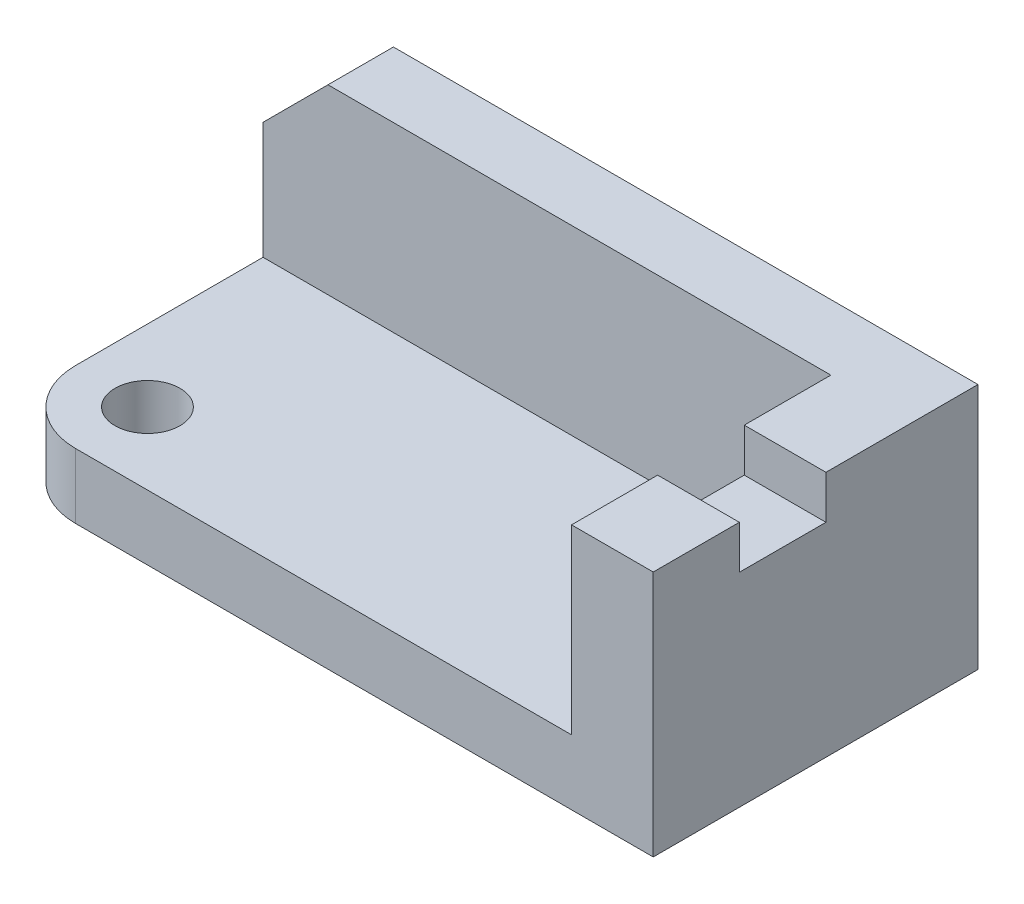
ISO-10303-21;
HEADER;
FILE_DESCRIPTION(('STEP AP214'),'2;1');
FILE_NAME('part.step','',(''),(''),'','','');
FILE_SCHEMA(('AUTOMOTIVE_DESIGN { 1 0 10303 214 1 1 1 1 }'));
ENDSEC;
DATA;
#1=APPLICATION_CONTEXT('core data for automotive mechanical design processes');
#2=APPLICATION_PROTOCOL_DEFINITION('international standard','automotive_design',2000,#1);
#3=PRODUCT_CONTEXT('',#1,'mechanical');
#4=PRODUCT('Part','Part','',(#3));
#5=PRODUCT_RELATED_PRODUCT_CATEGORY('part','',(#4));
#6=PRODUCT_DEFINITION_FORMATION('','',#4);
#7=PRODUCT_DEFINITION_CONTEXT('part definition',#1,'design');
#8=PRODUCT_DEFINITION('design','',#6,#7);
#9=PRODUCT_DEFINITION_SHAPE('','',#8);
#10=(LENGTH_UNIT() NAMED_UNIT(*) SI_UNIT(.MILLI.,.METRE.));
#11=(NAMED_UNIT(*) PLANE_ANGLE_UNIT() SI_UNIT($,.RADIAN.));
#12=(NAMED_UNIT(*) SI_UNIT($,.STERADIAN.) SOLID_ANGLE_UNIT());
#13=UNCERTAINTY_MEASURE_WITH_UNIT(LENGTH_MEASURE(1.E-05),#10,'distance_accuracy_value','');
#14=(GEOMETRIC_REPRESENTATION_CONTEXT(3) GLOBAL_UNCERTAINTY_ASSIGNED_CONTEXT((#13)) GLOBAL_UNIT_ASSIGNED_CONTEXT((#10,
#11,#12)) REPRESENTATION_CONTEXT('',''));
#15=CARTESIAN_POINT('',(0.,0.,0.));
#16=DIRECTION('',(0.,0.,1.));
#17=DIRECTION('',(1.,0.,0.));
#18=AXIS2_PLACEMENT_3D('',#15,#16,#17);
#19=CARTESIAN_POINT('',(0.,57.,0.));
#20=DIRECTION('',(0.,1.,0.));
#21=DIRECTION('',(0.,0.,1.));
#22=AXIS2_PLACEMENT_3D('',#19,#20,#21);
#23=PLANE('',#22);
#24=DIRECTION('',(-1.,0.,0.));
#25=VECTOR('',#24,1.);
#26=CARTESIAN_POINT('',(-18.8647914661121,57.,35.1133332353525));
#27=LINE('',#26,#25);
#28=CARTESIAN_POINT('',(0.,57.,35.1133332353525));
#29=VERTEX_POINT('',#28);
#30=CARTESIAN_POINT('',(-18.8647914661121,57.,35.1133332353525));
#31=VERTEX_POINT('',#30);
#32=EDGE_CURVE('E146',#29,#31,#27,.T.);
#33=ORIENTED_EDGE('',*,*,#32,.F.);
#34=DIRECTION('',(0.,0.,-1.));
#35=VECTOR('',#34,1.);
#36=CARTESIAN_POINT('',(0.,57.,0.));
#37=LINE('',#36,#35);
#38=CARTESIAN_POINT('',(0.,57.,0.));
#39=VERTEX_POINT('',#38);
#40=EDGE_CURVE('E162',#29,#39,#37,.T.);
#41=ORIENTED_EDGE('',*,*,#40,.T.);
#42=DIRECTION('',(-1.,0.,0.));
#43=VECTOR('',#42,1.);
#44=CARTESIAN_POINT('',(0.,57.,0.));
#45=LINE('',#44,#43);
#46=CARTESIAN_POINT('',(-135.,57.,0.));
#47=VERTEX_POINT('',#46);
#48=EDGE_CURVE('E161',#39,#47,#45,.T.);
#49=ORIENTED_EDGE('',*,*,#48,.T.);
#50=DIRECTION('',(0.,0.,1.));
#51=VECTOR('',#50,1.);
#52=CARTESIAN_POINT('',(-135.,57.,15.1133332353525));
#53=LINE('',#52,#51);
#54=CARTESIAN_POINT('',(-135.,57.,15.1133332353525));
#55=VERTEX_POINT('',#54);
#56=EDGE_CURVE('E226',#47,#55,#53,.T.);
#57=ORIENTED_EDGE('',*,*,#56,.T.);
#58=DIRECTION('',(1.,0.,0.));
#59=VECTOR('',#58,1.);
#60=CARTESIAN_POINT('',(-18.8647914661121,57.,15.1133332353525));
#61=LINE('',#60,#59);
#62=CARTESIAN_POINT('',(-18.8647914661121,57.,15.1133332353525));
#63=VERTEX_POINT('',#62);
#64=EDGE_CURVE('E165',#55,#63,#61,.T.);
#65=ORIENTED_EDGE('',*,*,#64,.T.);
#66=DIRECTION('',(0.,0.,1.));
#67=VECTOR('',#66,1.);
#68=CARTESIAN_POINT('',(-18.8647914661121,57.,15.1133332353525));
#69=LINE('',#68,#67);
#70=EDGE_CURVE('E167',#63,#31,#69,.T.);
#71=ORIENTED_EDGE('',*,*,#70,.T.);
#72=EDGE_LOOP('',(#33,#41,#49,#57,#65,#71));
#73=FACE_BOUND('',#72,.T.);
#74=ADVANCED_FACE('F36',(#73),#23,.T.);
#75=CARTESIAN_POINT('',(-133.396551724138,15.,58.3965517241379));
#76=DIRECTION('',(0.,1.,0.));
#77=DIRECTION('',(0.,0.,1.));
#78=AXIS2_PLACEMENT_3D('',#75,#76,#77);
#79=PLANE('',#78);
#80=DIRECTION('',(0.,0.,1.));
#81=VECTOR('',#80,1.);
#82=CARTESIAN_POINT('',(-18.8647914661121,15.,15.1133332353525));
#83=LINE('',#82,#81);
#84=CARTESIAN_POINT('',(-18.8647914661121,15.,15.1133332353525));
#85=VERTEX_POINT('',#84);
#86=CARTESIAN_POINT('',(-18.8647914661121,15.,75.));
#87=VERTEX_POINT('',#86);
#88=EDGE_CURVE('E177',#85,#87,#83,.T.);
#89=ORIENTED_EDGE('',*,*,#88,.F.);
#90=DIRECTION('',(1.,0.,0.));
#91=VECTOR('',#90,1.);
#92=CARTESIAN_POINT('',(-18.8647914661121,15.,15.1133332353525));
#93=LINE('',#92,#91);
#94=CARTESIAN_POINT('',(-150.,15.,15.1133332353525));
#95=VERTEX_POINT('',#94);
#96=EDGE_CURVE('E174',#95,#85,#93,.T.);
#97=ORIENTED_EDGE('',*,*,#96,.F.);
#98=DIRECTION('',(0.,0.,1.));
#99=VECTOR('',#98,1.);
#100=CARTESIAN_POINT('',(-150.,15.,58.3965517241379));
#101=LINE('',#100,#99);
#102=CARTESIAN_POINT('',(-150.,15.,58.3965517241379));
#103=VERTEX_POINT('',#102);
#104=EDGE_CURVE('E195',#95,#103,#101,.T.);
#105=ORIENTED_EDGE('',*,*,#104,.T.);
#106=CARTESIAN_POINT('',(-133.396551724138,15.,58.3965517241379));
#107=DIRECTION('',(0.,1.,0.));
#108=DIRECTION('',(0.,0.,1.));
#109=AXIS2_PLACEMENT_3D('',#106,#107,#108);
#110=CIRCLE('',#109,16.6034482758621);
#111=CARTESIAN_POINT('',(-133.396551724138,15.,75.));
#112=VERTEX_POINT('',#111);
#113=EDGE_CURVE('E197',#103,#112,#110,.T.);
#114=ORIENTED_EDGE('',*,*,#113,.T.);
#115=DIRECTION('',(1.,0.,0.));
#116=VECTOR('',#115,1.);
#117=CARTESIAN_POINT('',(-133.396551724138,15.,75.));
#118=LINE('',#117,#116);
#119=EDGE_CURVE('E200',#112,#87,#118,.T.);
#120=ORIENTED_EDGE('',*,*,#119,.T.);
#121=EDGE_LOOP('',(#89,#97,#105,#114,#120));
#122=FACE_BOUND('',#121,.T.);
#123=CARTESIAN_POINT('',(-133.396551724138,15.,58.3965517241379));
#124=DIRECTION('',(0.,1.,0.));
#125=DIRECTION('',(0.,0.,1.));
#126=AXIS2_PLACEMENT_3D('',#123,#124,#125);
#127=CIRCLE('',#126,7.50000000000001);
#128=CARTESIAN_POINT('',(-133.396551724138,15.,65.8965517241379));
#129=VERTEX_POINT('',#128);
#130=EDGE_CURVE('E189',#129,#129,#127,.T.);
#131=ORIENTED_EDGE('',*,*,#130,.F.);
#132=EDGE_LOOP('',(#131));
#133=FACE_BOUND('',#132,.T.);
#134=ADVANCED_FACE('F264',(#122,#133),#79,.T.);
#135=CARTESIAN_POINT('',(-133.396551724138,0.,58.3965517241379));
#136=DIRECTION('',(0.,1.,0.));
#137=DIRECTION('',(0.,0.,1.));
#138=AXIS2_PLACEMENT_3D('',#135,#136,#137);
#139=PLANE('',#138);
#140=DIRECTION('',(0.,0.,-1.));
#141=VECTOR('',#140,1.);
#142=CARTESIAN_POINT('',(0.,0.,75.));
#143=LINE('',#142,#141);
#144=CARTESIAN_POINT('',(0.,0.,75.));
#145=VERTEX_POINT('',#144);
#146=CARTESIAN_POINT('',(0.,0.,0.));
#147=VERTEX_POINT('',#146);
#148=EDGE_CURVE('E192',#145,#147,#143,.T.);
#149=ORIENTED_EDGE('',*,*,#148,.F.);
#150=DIRECTION('',(1.,0.,0.));
#151=VECTOR('',#150,1.);
#152=CARTESIAN_POINT('',(-133.396551724138,0.,75.));
#153=LINE('',#152,#151);
#154=CARTESIAN_POINT('',(-133.396551724138,0.,75.));
#155=VERTEX_POINT('',#154);
#156=EDGE_CURVE('E198',#155,#145,#153,.T.);
#157=ORIENTED_EDGE('',*,*,#156,.F.);
#158=CARTESIAN_POINT('',(-133.396551724138,0.,58.3965517241379));
#159=DIRECTION('',(0.,1.,0.));
#160=DIRECTION('',(0.,0.,1.));
#161=AXIS2_PLACEMENT_3D('',#158,#159,#160);
#162=CIRCLE('',#161,16.6034482758621);
#163=CARTESIAN_POINT('',(-150.,0.,58.3965517241379));
#164=VERTEX_POINT('',#163);
#165=EDGE_CURVE('E210',#164,#155,#162,.T.);
#166=ORIENTED_EDGE('',*,*,#165,.F.);
#167=DIRECTION('',(0.,0.,1.));
#168=VECTOR('',#167,1.);
#169=CARTESIAN_POINT('',(-150.,0.,58.3965517241379));
#170=LINE('',#169,#168);
#171=CARTESIAN_POINT('',(-150.,0.,0.));
#172=VERTEX_POINT('',#171);
#173=EDGE_CURVE('E208',#172,#164,#170,.T.);
#174=ORIENTED_EDGE('',*,*,#173,.F.);
#175=DIRECTION('',(-1.,0.,0.));
#176=VECTOR('',#175,1.);
#177=CARTESIAN_POINT('',(-150.,0.,0.));
#178=LINE('',#177,#176);
#179=EDGE_CURVE('E205',#147,#172,#178,.T.);
#180=ORIENTED_EDGE('',*,*,#179,.F.);
#181=EDGE_LOOP('',(#149,#157,#166,#174,#180));
#182=FACE_BOUND('',#181,.T.);
#183=CARTESIAN_POINT('',(-133.396551724138,0.,58.3965517241379));
#184=DIRECTION('',(0.,1.,0.));
#185=DIRECTION('',(0.,0.,1.));
#186=AXIS2_PLACEMENT_3D('',#183,#184,#185);
#187=CIRCLE('',#186,7.50000000000001);
#188=CARTESIAN_POINT('',(-133.396551724138,0.,65.8965517241379));
#189=VERTEX_POINT('',#188);
#190=EDGE_CURVE('E188',#189,#189,#187,.T.);
#191=ORIENTED_EDGE('',*,*,#190,.T.);
#192=EDGE_LOOP('',(#191));
#193=FACE_BOUND('',#192,.T.);
#194=ADVANCED_FACE('F255',(#182,#193),#139,.F.);
#195=CARTESIAN_POINT('',(0.,15.,75.));
#196=DIRECTION('',(-1.,0.,0.));
#197=DIRECTION('',(0.,0.,1.));
#198=AXIS2_PLACEMENT_3D('',#195,#196,#197);
#199=PLANE('',#198);
#200=ORIENTED_EDGE('',*,*,#40,.F.);
#201=DIRECTION('',(0.,1.,0.));
#202=VECTOR('',#201,1.);
#203=CARTESIAN_POINT('',(0.,47.,35.1133332353525));
#204=LINE('',#203,#202);
#205=CARTESIAN_POINT('',(0.,47.,35.1133332353525));
#206=VERTEX_POINT('',#205);
#207=EDGE_CURVE('E153',#206,#29,#204,.T.);
#208=ORIENTED_EDGE('',*,*,#207,.F.);
#209=DIRECTION('',(0.,0.,-1.));
#210=VECTOR('',#209,1.);
#211=CARTESIAN_POINT('',(0.,47.,35.1133332353525));
#212=LINE('',#211,#210);
#213=CARTESIAN_POINT('',(0.,47.,55.1133332353525));
#214=VERTEX_POINT('',#213);
#215=EDGE_CURVE('E136',#214,#206,#212,.T.);
#216=ORIENTED_EDGE('',*,*,#215,.F.);
#217=DIRECTION('',(0.,1.,0.));
#218=VECTOR('',#217,1.);
#219=CARTESIAN_POINT('',(0.,47.,55.1133332353525));
#220=LINE('',#219,#218);
#221=CARTESIAN_POINT('',(0.,57.,55.1133332353525));
#222=VERTEX_POINT('',#221);
#223=EDGE_CURVE('E133',#214,#222,#220,.T.);
#224=ORIENTED_EDGE('',*,*,#223,.T.);
#225=CARTESIAN_POINT('',(0.,57.,75.));
#226=VERTEX_POINT('',#225);
#227=EDGE_CURVE('E158',#226,#222,#37,.T.);
#228=ORIENTED_EDGE('',*,*,#227,.F.);
#229=DIRECTION('',(0.,-1.,0.));
#230=VECTOR('',#229,1.);
#231=CARTESIAN_POINT('',(0.,15.,75.));
#232=LINE('',#231,#230);
#233=EDGE_CURVE('E202',#226,#145,#232,.T.);
#234=ORIENTED_EDGE('',*,*,#233,.T.);
#235=ORIENTED_EDGE('',*,*,#148,.T.);
#236=DIRECTION('',(0.,-1.,0.));
#237=VECTOR('',#236,1.);
#238=CARTESIAN_POINT('',(0.,15.,0.));
#239=LINE('',#238,#237);
#240=EDGE_CURVE('E223',#39,#147,#239,.T.);
#241=ORIENTED_EDGE('',*,*,#240,.F.);
#242=EDGE_LOOP('',(#200,#208,#216,#224,#228,#234,#235,#241));
#243=FACE_BOUND('',#242,.T.);
#244=ADVANCED_FACE('F250',(#243),#199,.F.);
#245=CARTESIAN_POINT('',(-150.,15.,0.));
#246=DIRECTION('',(0.,0.,1.));
#247=DIRECTION('',(1.,0.,0.));
#248=AXIS2_PLACEMENT_3D('',#245,#246,#247);
#249=PLANE('',#248);
#250=DIRECTION('',(0.,-1.,0.));
#251=VECTOR('',#250,1.);
#252=CARTESIAN_POINT('',(-150.,15.,0.));
#253=LINE('',#252,#251);
#254=CARTESIAN_POINT('',(-150.,42.,0.));
#255=VERTEX_POINT('',#254);
#256=EDGE_CURVE('E221',#255,#172,#253,.T.);
#257=ORIENTED_EDGE('',*,*,#256,.F.);
#258=DIRECTION('',(0.707106781186546,0.707106781186549,0.));
#259=VECTOR('',#258,1.);
#260=CARTESIAN_POINT('',(-135.,57.,0.));
#261=LINE('',#260,#259);
#262=EDGE_CURVE('E11',#255,#47,#261,.T.);
#263=ORIENTED_EDGE('',*,*,#262,.T.);
#264=ORIENTED_EDGE('',*,*,#48,.F.);
#265=ORIENTED_EDGE('',*,*,#240,.T.);
#266=ORIENTED_EDGE('',*,*,#179,.T.);
#267=EDGE_LOOP('',(#257,#263,#264,#265,#266));
#268=FACE_BOUND('',#267,.T.);
#269=ADVANCED_FACE('F243',(#268),#249,.F.);
#270=CARTESIAN_POINT('',(-150.,15.,58.3965517241379));
#271=DIRECTION('',(1.,0.,0.));
#272=DIRECTION('',(0.,0.,-1.));
#273=AXIS2_PLACEMENT_3D('',#270,#271,#272);
#274=PLANE('',#273);
#275=DIRECTION('',(0.,-1.,0.));
#276=VECTOR('',#275,1.);
#277=CARTESIAN_POINT('',(-150.,57.,15.1133332353525));
#278=LINE('',#277,#276);
#279=CARTESIAN_POINT('',(-150.,42.,15.1133332353525));
#280=VERTEX_POINT('',#279);
#281=EDGE_CURVE('E186',#280,#95,#278,.T.);
#282=ORIENTED_EDGE('',*,*,#281,.F.);
#283=DIRECTION('',(0.,0.,-1.));
#284=VECTOR('',#283,1.);
#285=CARTESIAN_POINT('',(-150.,42.,0.));
#286=LINE('',#285,#284);
#287=EDGE_CURVE('E45',#280,#255,#286,.T.);
#288=ORIENTED_EDGE('',*,*,#287,.T.);
#289=ORIENTED_EDGE('',*,*,#256,.T.);
#290=ORIENTED_EDGE('',*,*,#173,.T.);
#291=DIRECTION('',(0.,-1.,0.));
#292=VECTOR('',#291,1.);
#293=CARTESIAN_POINT('',(-150.,15.,58.3965517241379));
#294=LINE('',#293,#292);
#295=EDGE_CURVE('E218',#103,#164,#294,.T.);
#296=ORIENTED_EDGE('',*,*,#295,.F.);
#297=ORIENTED_EDGE('',*,*,#104,.F.);
#298=EDGE_LOOP('',(#282,#288,#289,#290,#296,#297));
#299=FACE_BOUND('',#298,.T.);
#300=ADVANCED_FACE('F238',(#299),#274,.F.);
#301=CARTESIAN_POINT('',(-133.396551724138,15.,58.3965517241379));
#302=DIRECTION('',(0.,-1.,0.));
#303=DIRECTION('',(0.,0.,-1.));
#304=AXIS2_PLACEMENT_3D('',#301,#302,#303);
#305=CYLINDRICAL_SURFACE('',#304,16.6034482758621);
#306=ORIENTED_EDGE('',*,*,#165,.T.);
#307=DIRECTION('',(0.,-1.,0.));
#308=VECTOR('',#307,1.);
#309=CARTESIAN_POINT('',(-133.396551724138,15.,75.));
#310=LINE('',#309,#308);
#311=EDGE_CURVE('E215',#112,#155,#310,.T.);
#312=ORIENTED_EDGE('',*,*,#311,.F.);
#313=ORIENTED_EDGE('',*,*,#113,.F.);
#314=ORIENTED_EDGE('',*,*,#295,.T.);
#315=EDGE_LOOP('',(#306,#312,#313,#314));
#316=FACE_BOUND('',#315,.T.);
#317=ADVANCED_FACE('F260',(#316),#305,.T.);
#318=CARTESIAN_POINT('',(-133.396551724138,15.,75.));
#319=DIRECTION('',(0.,0.,-1.));
#320=DIRECTION('',(-1.,0.,0.));
#321=AXIS2_PLACEMENT_3D('',#318,#319,#320);
#322=PLANE('',#321);
#323=ORIENTED_EDGE('',*,*,#156,.T.);
#324=ORIENTED_EDGE('',*,*,#233,.F.);
#325=DIRECTION('',(1.,0.,0.));
#326=VECTOR('',#325,1.);
#327=CARTESIAN_POINT('',(-18.8647914661121,57.,75.));
#328=LINE('',#327,#326);
#329=CARTESIAN_POINT('',(-18.8647914661121,57.,75.));
#330=VERTEX_POINT('',#329);
#331=EDGE_CURVE('E170',#330,#226,#328,.T.);
#332=ORIENTED_EDGE('',*,*,#331,.F.);
#333=DIRECTION('',(0.,-1.,0.));
#334=VECTOR('',#333,1.);
#335=CARTESIAN_POINT('',(-18.8647914661121,57.,75.));
#336=LINE('',#335,#334);
#337=EDGE_CURVE('E173',#330,#87,#336,.T.);
#338=ORIENTED_EDGE('',*,*,#337,.T.);
#339=ORIENTED_EDGE('',*,*,#119,.F.);
#340=ORIENTED_EDGE('',*,*,#311,.T.);
#341=EDGE_LOOP('',(#323,#324,#332,#338,#339,#340));
#342=FACE_BOUND('',#341,.T.);
#343=ADVANCED_FACE('F298',(#342),#322,.F.);
#344=CARTESIAN_POINT('',(-133.396551724138,15.,58.3965517241379));
#345=DIRECTION('',(0.,-1.,0.));
#346=DIRECTION('',(0.,0.,-1.));
#347=AXIS2_PLACEMENT_3D('',#344,#345,#346);
#348=CYLINDRICAL_SURFACE('',#347,7.50000000000001);
#349=ORIENTED_EDGE('',*,*,#130,.T.);
#350=EDGE_LOOP('',(#349));
#351=FACE_BOUND('',#350,.T.);
#352=ORIENTED_EDGE('',*,*,#190,.F.);
#353=EDGE_LOOP('',(#352));
#354=FACE_BOUND('',#353,.T.);
#355=ADVANCED_FACE('F300',(#351,#354),#348,.F.);
#356=CARTESIAN_POINT('',(-18.8647914661121,57.,15.1133332353525));
#357=DIRECTION('',(0.,0.,-1.));
#358=DIRECTION('',(-1.,0.,0.));
#359=AXIS2_PLACEMENT_3D('',#356,#357,#358);
#360=PLANE('',#359);
#361=ORIENTED_EDGE('',*,*,#64,.F.);
#362=DIRECTION('',(-0.707106781186546,-0.707106781186549,0.));
#363=VECTOR('',#362,1.);
#364=CARTESIAN_POINT('',(-135.,57.,15.1133332353525));
#365=LINE('',#364,#363);
#366=EDGE_CURVE('E229',#55,#280,#365,.T.);
#367=ORIENTED_EDGE('',*,*,#366,.T.);
#368=ORIENTED_EDGE('',*,*,#281,.T.);
#369=ORIENTED_EDGE('',*,*,#96,.T.);
#370=DIRECTION('',(0.,-1.,0.));
#371=VECTOR('',#370,1.);
#372=CARTESIAN_POINT('',(-18.8647914661121,57.,15.1133332353525));
#373=LINE('',#372,#371);
#374=EDGE_CURVE('E183',#63,#85,#373,.T.);
#375=ORIENTED_EDGE('',*,*,#374,.F.);
#376=EDGE_LOOP('',(#361,#367,#368,#369,#375));
#377=FACE_BOUND('',#376,.T.);
#378=ADVANCED_FACE('F232',(#377),#360,.F.);
#379=CARTESIAN_POINT('',(-18.8647914661121,57.,15.1133332353525));
#380=DIRECTION('',(1.,0.,0.));
#381=DIRECTION('',(0.,0.,-1.));
#382=AXIS2_PLACEMENT_3D('',#379,#380,#381);
#383=PLANE('',#382);
#384=DIRECTION('',(0.,0.,1.));
#385=VECTOR('',#384,1.);
#386=CARTESIAN_POINT('',(-18.8647914661121,47.,35.1133332353525));
#387=LINE('',#386,#385);
#388=CARTESIAN_POINT('',(-18.8647914661121,47.,35.1133332353525));
#389=VERTEX_POINT('',#388);
#390=CARTESIAN_POINT('',(-18.8647914661121,47.,55.1133332353525));
#391=VERTEX_POINT('',#390);
#392=EDGE_CURVE('E137',#389,#391,#387,.T.);
#393=ORIENTED_EDGE('',*,*,#392,.F.);
#394=DIRECTION('',(0.,1.,0.));
#395=VECTOR('',#394,1.);
#396=CARTESIAN_POINT('',(-18.8647914661121,47.,35.1133332353525));
#397=LINE('',#396,#395);
#398=EDGE_CURVE('E178',#389,#31,#397,.T.);
#399=ORIENTED_EDGE('',*,*,#398,.T.);
#400=ORIENTED_EDGE('',*,*,#70,.F.);
#401=ORIENTED_EDGE('',*,*,#374,.T.);
#402=ORIENTED_EDGE('',*,*,#88,.T.);
#403=ORIENTED_EDGE('',*,*,#337,.F.);
#404=CARTESIAN_POINT('',(-18.8647914661121,57.,55.1133332353524));
#405=VERTEX_POINT('',#404);
#406=EDGE_CURVE('E151',#405,#330,#69,.T.);
#407=ORIENTED_EDGE('',*,*,#406,.F.);
#408=DIRECTION('',(0.,1.,0.));
#409=VECTOR('',#408,1.);
#410=CARTESIAN_POINT('',(-18.8647914661121,47.,55.1133332353525));
#411=LINE('',#410,#409);
#412=EDGE_CURVE('E52',#391,#405,#411,.T.);
#413=ORIENTED_EDGE('',*,*,#412,.F.);
#414=EDGE_LOOP('',(#393,#399,#400,#401,#402,#403,#407,#413));
#415=FACE_BOUND('',#414,.T.);
#416=ADVANCED_FACE('F149',(#415),#383,.F.);
#417=DIRECTION('',(1.,0.,0.));
#418=VECTOR('',#417,1.);
#419=CARTESIAN_POINT('',(-18.8647914661121,57.,55.1133332353525));
#420=LINE('',#419,#418);
#421=EDGE_CURVE('E271',#405,#222,#420,.T.);
#422=ORIENTED_EDGE('',*,*,#421,.F.);
#423=ORIENTED_EDGE('',*,*,#406,.T.);
#424=ORIENTED_EDGE('',*,*,#331,.T.);
#425=ORIENTED_EDGE('',*,*,#227,.T.);
#426=EDGE_LOOP('',(#422,#423,#424,#425));
#427=FACE_BOUND('',#426,.T.);
#428=ADVANCED_FACE('F281',(#427),#23,.T.);
#429=CARTESIAN_POINT('',(-135.,57.,0.));
#430=DIRECTION('',(-0.707106781186549,0.707106781186545,0.));
#431=DIRECTION('',(0.,0.,-1.));
#432=AXIS2_PLACEMENT_3D('',#429,#430,#431);
#433=PLANE('',#432);
#434=ORIENTED_EDGE('',*,*,#262,.F.);
#435=ORIENTED_EDGE('',*,*,#287,.F.);
#436=ORIENTED_EDGE('',*,*,#366,.F.);
#437=ORIENTED_EDGE('',*,*,#56,.F.);
#438=EDGE_LOOP('',(#434,#435,#436,#437));
#439=FACE_BOUND('',#438,.T.);
#440=ADVANCED_FACE('F39',(#439),#433,.T.);
#441=CARTESIAN_POINT('',(-18.8647914661121,47.,35.1133332353525));
#442=DIRECTION('',(0.,0.,-1.));
#443=DIRECTION('',(-1.,0.,0.));
#444=AXIS2_PLACEMENT_3D('',#441,#442,#443);
#445=PLANE('',#444);
#446=ORIENTED_EDGE('',*,*,#32,.T.);
#447=ORIENTED_EDGE('',*,*,#398,.F.);
#448=DIRECTION('',(-1.,0.,0.));
#449=VECTOR('',#448,1.);
#450=CARTESIAN_POINT('',(-18.8647914661121,47.,35.1133332353525));
#451=LINE('',#450,#449);
#452=EDGE_CURVE('E143',#206,#389,#451,.T.);
#453=ORIENTED_EDGE('',*,*,#452,.F.);
#454=ORIENTED_EDGE('',*,*,#207,.T.);
#455=EDGE_LOOP('',(#446,#447,#453,#454));
#456=FACE_BOUND('',#455,.T.);
#457=ADVANCED_FACE('F273',(#456),#445,.F.);
#458=CARTESIAN_POINT('',(-18.8647914661121,47.,55.1133332353525));
#459=DIRECTION('',(0.,0.,1.));
#460=DIRECTION('',(1.,0.,0.));
#461=AXIS2_PLACEMENT_3D('',#458,#459,#460);
#462=PLANE('',#461);
#463=ORIENTED_EDGE('',*,*,#421,.T.);
#464=ORIENTED_EDGE('',*,*,#223,.F.);
#465=DIRECTION('',(1.,0.,0.));
#466=VECTOR('',#465,1.);
#467=CARTESIAN_POINT('',(-18.8647914661121,47.,55.1133332353525));
#468=LINE('',#467,#466);
#469=EDGE_CURVE('E129',#391,#214,#468,.T.);
#470=ORIENTED_EDGE('',*,*,#469,.F.);
#471=ORIENTED_EDGE('',*,*,#412,.T.);
#472=EDGE_LOOP('',(#463,#464,#470,#471));
#473=FACE_BOUND('',#472,.T.);
#474=ADVANCED_FACE('F131',(#473),#462,.F.);
#475=CARTESIAN_POINT('',(0.,47.,0.));
#476=DIRECTION('',(0.,1.,0.));
#477=DIRECTION('',(0.,0.,1.));
#478=AXIS2_PLACEMENT_3D('',#475,#476,#477);
#479=PLANE('',#478);
#480=ORIENTED_EDGE('',*,*,#392,.T.);
#481=ORIENTED_EDGE('',*,*,#469,.T.);
#482=ORIENTED_EDGE('',*,*,#215,.T.);
#483=ORIENTED_EDGE('',*,*,#452,.T.);
#484=EDGE_LOOP('',(#480,#481,#482,#483));
#485=FACE_BOUND('',#484,.T.);
#486=ADVANCED_FACE('F141',(#485),#479,.T.);
#487=CLOSED_SHELL('',(#74,#134,#194,#244,#269,#300,#317,#343,#355,#378,#416,#428,#440,#457,#474,#486));
#488=MANIFOLD_SOLID_BREP('B2',#487);
#489=ADVANCED_BREP_SHAPE_REPRESENTATION('',(#18,#488),#14);
#490=SHAPE_DEFINITION_REPRESENTATION(#9,#489);
ENDSEC;
END-ISO-10303-21;
